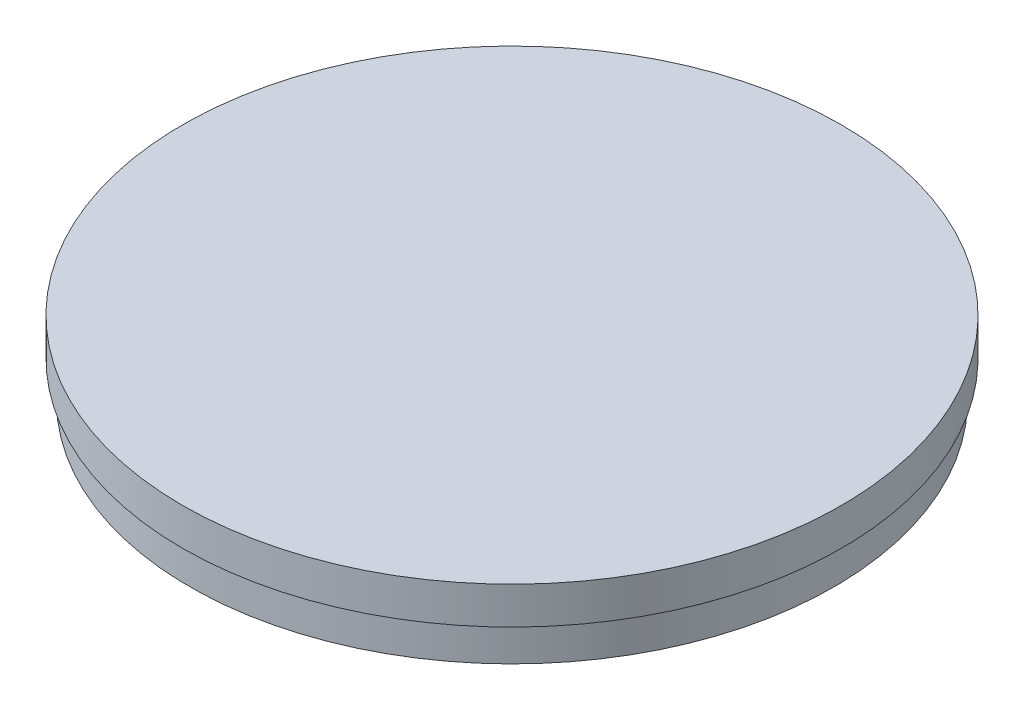
ISO-10303-21;
HEADER;
FILE_DESCRIPTION(('STEP AP214'),'2;1');
FILE_NAME('part.step','',(''),(''),'','','');
FILE_SCHEMA(('AUTOMOTIVE_DESIGN { 1 0 10303 214 1 1 1 1 }'));
ENDSEC;
DATA;
#1=APPLICATION_CONTEXT('core data for automotive mechanical design processes');
#2=APPLICATION_PROTOCOL_DEFINITION('international standard','automotive_design',2000,#1);
#3=PRODUCT_CONTEXT('',#1,'mechanical');
#4=PRODUCT('Part','Part','',(#3));
#5=PRODUCT_RELATED_PRODUCT_CATEGORY('part','',(#4));
#6=PRODUCT_DEFINITION_FORMATION('','',#4);
#7=PRODUCT_DEFINITION_CONTEXT('part definition',#1,'design');
#8=PRODUCT_DEFINITION('design','',#6,#7);
#9=PRODUCT_DEFINITION_SHAPE('','',#8);
#10=(LENGTH_UNIT() NAMED_UNIT(*) SI_UNIT(.MILLI.,.METRE.));
#11=(NAMED_UNIT(*) PLANE_ANGLE_UNIT() SI_UNIT($,.RADIAN.));
#12=(NAMED_UNIT(*) SI_UNIT($,.STERADIAN.) SOLID_ANGLE_UNIT());
#13=UNCERTAINTY_MEASURE_WITH_UNIT(LENGTH_MEASURE(1.E-05),#10,'distance_accuracy_value','');
#14=(GEOMETRIC_REPRESENTATION_CONTEXT(3) GLOBAL_UNCERTAINTY_ASSIGNED_CONTEXT((#13)) GLOBAL_UNIT_ASSIGNED_CONTEXT((#10,
#11,#12)) REPRESENTATION_CONTEXT('',''));
#15=CARTESIAN_POINT('',(0.,0.,0.));
#16=DIRECTION('',(0.,0.,1.));
#17=DIRECTION('',(1.,0.,0.));
#18=AXIS2_PLACEMENT_3D('',#15,#16,#17);
#19=CARTESIAN_POINT('',(0.,0.,0.));
#20=DIRECTION('',(0.,-1.,0.));
#21=DIRECTION('',(0.,0.,-1.));
#22=AXIS2_PLACEMENT_3D('',#19,#20,#21);
#23=PLANE('',#22);
#24=CARTESIAN_POINT('',(0.,0.,0.));
#25=DIRECTION('',(0.,-1.,0.));
#26=DIRECTION('',(0.,0.,-1.));
#27=AXIS2_PLACEMENT_3D('',#24,#25,#26);
#28=CIRCLE('',#27,51.7652);
#29=CARTESIAN_POINT('',(0.,0.,-51.7652));
#30=VERTEX_POINT('',#29);
#31=EDGE_CURVE('E45',#30,#30,#28,.T.);
#32=ORIENTED_EDGE('',*,*,#31,.T.);
#33=EDGE_LOOP('',(#32));
#34=FACE_BOUND('',#33,.T.);
#35=ADVANCED_FACE('F31',(#34),#23,.T.);
#36=CARTESIAN_POINT('',(0.,11.938,0.));
#37=DIRECTION('',(0.,1.,0.));
#38=DIRECTION('',(0.,0.,1.));
#39=AXIS2_PLACEMENT_3D('',#36,#37,#38);
#40=PLANE('',#39);
#41=CARTESIAN_POINT('',(0.,11.938,0.));
#42=DIRECTION('',(0.,-1.,0.));
#43=DIRECTION('',(0.,0.,-1.));
#44=AXIS2_PLACEMENT_3D('',#41,#42,#43);
#45=CIRCLE('',#44,52.959);
#46=CARTESIAN_POINT('',(0.,11.938,-52.959));
#47=VERTEX_POINT('',#46);
#48=EDGE_CURVE('E10',#47,#47,#45,.T.);
#49=ORIENTED_EDGE('',*,*,#48,.F.);
#50=EDGE_LOOP('',(#49));
#51=FACE_BOUND('',#50,.T.);
#52=ADVANCED_FACE('F63',(#51),#40,.T.);
#53=CARTESIAN_POINT('',(0.,0.,0.));
#54=DIRECTION('',(0.,-1.,0.));
#55=DIRECTION('',(0.,0.,-1.));
#56=AXIS2_PLACEMENT_3D('',#53,#54,#55);
#57=CYLINDRICAL_SURFACE('',#56,52.959);
#58=ORIENTED_EDGE('',*,*,#48,.T.);
#59=EDGE_LOOP('',(#58));
#60=FACE_BOUND('',#59,.T.);
#61=CARTESIAN_POINT('',(0.,5.969,0.));
#62=DIRECTION('',(0.,-1.,0.));
#63=DIRECTION('',(0.,0.,-1.));
#64=AXIS2_PLACEMENT_3D('',#61,#62,#63);
#65=CIRCLE('',#64,52.959);
#66=CARTESIAN_POINT('',(0.,5.969,-52.959));
#67=VERTEX_POINT('',#66);
#68=EDGE_CURVE('E37',#67,#67,#65,.T.);
#69=ORIENTED_EDGE('',*,*,#68,.F.);
#70=EDGE_LOOP('',(#69));
#71=FACE_BOUND('',#70,.T.);
#72=ADVANCED_FACE('F60',(#60,#71),#57,.T.);
#73=CARTESIAN_POINT('',(52.959,5.969,0.));
#74=DIRECTION('',(0.,-1.,0.));
#75=DIRECTION('',(0.,0.,-1.));
#76=AXIS2_PLACEMENT_3D('',#73,#74,#75);
#77=PLANE('',#76);
#78=ORIENTED_EDGE('',*,*,#68,.T.);
#79=EDGE_LOOP('',(#78));
#80=FACE_BOUND('',#79,.T.);
#81=CARTESIAN_POINT('',(0.,5.969,0.));
#82=DIRECTION('',(0.,-1.,0.));
#83=DIRECTION('',(0.,0.,-1.));
#84=AXIS2_PLACEMENT_3D('',#81,#82,#83);
#85=CIRCLE('',#84,51.7652);
#86=CARTESIAN_POINT('',(0.,5.969,-51.7652));
#87=VERTEX_POINT('',#86);
#88=EDGE_CURVE('E41',#87,#87,#85,.T.);
#89=ORIENTED_EDGE('',*,*,#88,.F.);
#90=EDGE_LOOP('',(#89));
#91=FACE_BOUND('',#90,.T.);
#92=ADVANCED_FACE('F54',(#80,#91),#77,.T.);
#93=CARTESIAN_POINT('',(0.,0.,0.));
#94=DIRECTION('',(0.,-1.,0.));
#95=DIRECTION('',(0.,0.,-1.));
#96=AXIS2_PLACEMENT_3D('',#93,#94,#95);
#97=CYLINDRICAL_SURFACE('',#96,51.7652);
#98=ORIENTED_EDGE('',*,*,#88,.T.);
#99=EDGE_LOOP('',(#98));
#100=FACE_BOUND('',#99,.T.);
#101=ORIENTED_EDGE('',*,*,#31,.F.);
#102=EDGE_LOOP('',(#101));
#103=FACE_BOUND('',#102,.T.);
#104=ADVANCED_FACE('F52',(#100,#103),#97,.T.);
#105=CLOSED_SHELL('',(#35,#52,#72,#92,#104));
#106=MANIFOLD_SOLID_BREP('B2',#105);
#107=ADVANCED_BREP_SHAPE_REPRESENTATION('',(#18,#106),#14);
#108=SHAPE_DEFINITION_REPRESENTATION(#9,#107);
ENDSEC;
END-ISO-10303-21;
